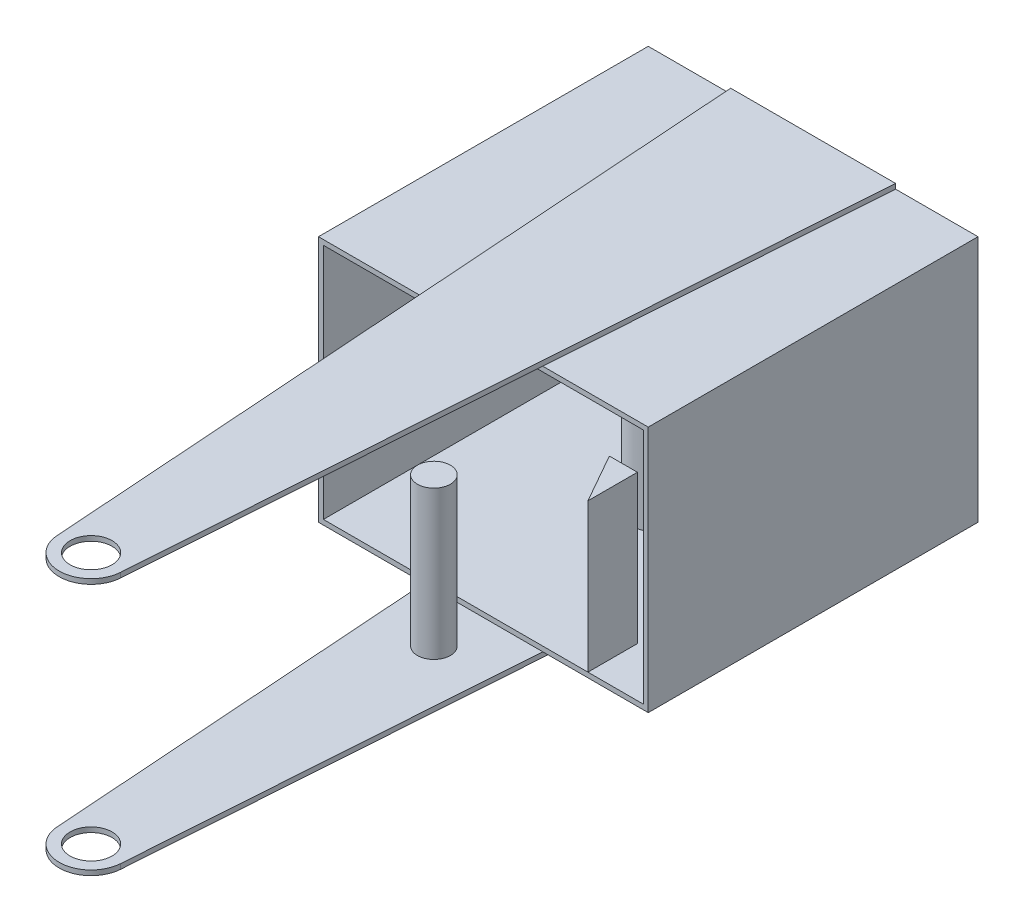
ISO-10303-21;
HEADER;
FILE_DESCRIPTION(('STEP AP214'),'2;1');
FILE_NAME('part.step','',(''),(''),'','','');
FILE_SCHEMA(('AUTOMOTIVE_DESIGN { 1 0 10303 214 1 1 1 1 }'));
ENDSEC;
DATA;
#1=APPLICATION_CONTEXT('core data for automotive mechanical design processes');
#2=APPLICATION_PROTOCOL_DEFINITION('international standard','automotive_design',2000,#1);
#3=PRODUCT_CONTEXT('',#1,'mechanical');
#4=PRODUCT('Part','Part','',(#3));
#5=PRODUCT_RELATED_PRODUCT_CATEGORY('part','',(#4));
#6=PRODUCT_DEFINITION_FORMATION('','',#4);
#7=PRODUCT_DEFINITION_CONTEXT('part definition',#1,'design');
#8=PRODUCT_DEFINITION('design','',#6,#7);
#9=PRODUCT_DEFINITION_SHAPE('','',#8);
#10=(LENGTH_UNIT() NAMED_UNIT(*) SI_UNIT(.MILLI.,.METRE.));
#11=(NAMED_UNIT(*) PLANE_ANGLE_UNIT() SI_UNIT($,.RADIAN.));
#12=(NAMED_UNIT(*) SI_UNIT($,.STERADIAN.) SOLID_ANGLE_UNIT());
#13=UNCERTAINTY_MEASURE_WITH_UNIT(LENGTH_MEASURE(1.E-05),#10,'distance_accuracy_value','');
#14=(GEOMETRIC_REPRESENTATION_CONTEXT(3) GLOBAL_UNCERTAINTY_ASSIGNED_CONTEXT((#13)) GLOBAL_UNIT_ASSIGNED_CONTEXT((#10,
#11,#12)) REPRESENTATION_CONTEXT('',''));
#15=CARTESIAN_POINT('',(0.,0.,0.));
#16=DIRECTION('',(0.,0.,1.));
#17=DIRECTION('',(1.,0.,0.));
#18=AXIS2_PLACEMENT_3D('',#15,#16,#17);
#19=CARTESIAN_POINT('',(0.,3.,200.));
#20=DIRECTION('',(0.,1.,0.));
#21=DIRECTION('',(0.,0.,1.));
#22=AXIS2_PLACEMENT_3D('',#19,#20,#21);
#23=PLANE('',#22);
#24=CARTESIAN_POINT('',(100.,3.,95.));
#25=DIRECTION('',(0.,1.,0.));
#26=DIRECTION('',(0.,0.,1.));
#27=AXIS2_PLACEMENT_3D('',#24,#25,#26);
#28=CIRCLE('',#27,15.);
#29=CARTESIAN_POINT('',(100.,2.99999999999999,80.));
#30=VERTEX_POINT('',#29);
#31=EDGE_CURVE('E229',#30,#30,#28,.T.);
#32=ORIENTED_EDGE('',*,*,#31,.F.);
#33=EDGE_LOOP('',(#32));
#34=FACE_BOUND('',#33,.T.);
#35=DIRECTION('',(1.,0.,0.));
#36=VECTOR('',#35,1.);
#37=CARTESIAN_POINT('',(0.,3.,200.));
#38=LINE('',#37,#36);
#39=CARTESIAN_POINT('',(3.,3.,200.));
#40=VERTEX_POINT('',#39);
#41=CARTESIAN_POINT('',(163.429598438491,3.,200.));
#42=VERTEX_POINT('',#41);
#43=EDGE_CURVE('E368',#40,#42,#38,.T.);
#44=ORIENTED_EDGE('',*,*,#43,.T.);
#45=DIRECTION('',(0.493012571980881,0.,0.870022185848612));
#46=VECTOR('',#45,1.);
#47=CARTESIAN_POINT('',(163.429598438491,3.,200.));
#48=LINE('',#47,#46);
#49=CARTESIAN_POINT('',(146.429598438491,3.,170.));
#50=VERTEX_POINT('',#49);
#51=EDGE_CURVE('E213',#50,#42,#48,.T.);
#52=ORIENTED_EDGE('',*,*,#51,.F.);
#53=DIRECTION('',(-1.,0.,0.));
#54=VECTOR('',#53,1.);
#55=CARTESIAN_POINT('',(146.429598438491,3.,170.));
#56=LINE('',#55,#54);
#57=CARTESIAN_POINT('',(163.429598438491,3.,170.));
#58=VERTEX_POINT('',#57);
#59=EDGE_CURVE('E209',#58,#50,#56,.T.);
#60=ORIENTED_EDGE('',*,*,#59,.F.);
#61=DIRECTION('',(0.,0.,-1.));
#62=VECTOR('',#61,1.);
#63=CARTESIAN_POINT('',(163.429598438491,3.,170.));
#64=LINE('',#63,#62);
#65=EDGE_CURVE('E787',#42,#58,#64,.T.);
#66=ORIENTED_EDGE('',*,*,#65,.F.);
#67=CARTESIAN_POINT('',(197.,3.,200.));
#68=VERTEX_POINT('',#67);
#69=EDGE_CURVE('E367',#42,#68,#38,.T.);
#70=ORIENTED_EDGE('',*,*,#69,.T.);
#71=DIRECTION('',(0.,0.,-1.));
#72=VECTOR('',#71,1.);
#73=CARTESIAN_POINT('',(197.,3.,200.));
#74=LINE('',#73,#72);
#75=CARTESIAN_POINT('',(197.,3.,3.));
#76=VERTEX_POINT('',#75);
#77=EDGE_CURVE('E343',#68,#76,#74,.T.);
#78=ORIENTED_EDGE('',*,*,#77,.T.);
#79=DIRECTION('',(1.,0.,0.));
#80=VECTOR('',#79,1.);
#81=CARTESIAN_POINT('',(0.,3.,3.));
#82=LINE('',#81,#80);
#83=CARTESIAN_POINT('',(3.,3.,3.));
#84=VERTEX_POINT('',#83);
#85=EDGE_CURVE('E337',#84,#76,#82,.T.);
#86=ORIENTED_EDGE('',*,*,#85,.F.);
#87=DIRECTION('',(0.,0.,-1.));
#88=VECTOR('',#87,1.);
#89=CARTESIAN_POINT('',(3.,3.,200.));
#90=LINE('',#89,#88);
#91=EDGE_CURVE('E338',#40,#84,#90,.T.);
#92=ORIENTED_EDGE('',*,*,#91,.F.);
#93=EDGE_LOOP('',(#44,#52,#60,#66,#70,#78,#86,#92));
#94=FACE_BOUND('',#93,.T.);
#95=ADVANCED_FACE('F45',(#34,#94),#23,.T.);
#96=CARTESIAN_POINT('',(0.,0.,200.));
#97=DIRECTION('',(0.,1.,0.));
#98=DIRECTION('',(0.,0.,1.));
#99=AXIS2_PLACEMENT_3D('',#96,#97,#98);
#100=PLANE('',#99);
#101=DIRECTION('',(1.,0.,0.));
#102=VECTOR('',#101,1.);
#103=CARTESIAN_POINT('',(0.,0.,200.));
#104=LINE('',#103,#102);
#105=CARTESIAN_POINT('',(136.014637611297,0.,200.));
#106=VERTEX_POINT('',#105);
#107=CARTESIAN_POINT('',(200.,0.,200.));
#108=VERTEX_POINT('',#107);
#109=EDGE_CURVE('E382',#106,#108,#104,.T.);
#110=ORIENTED_EDGE('',*,*,#109,.F.);
#111=DIRECTION('',(0.0697564737441293,0.,-0.997564050259824));
#112=VECTOR('',#111,1.);
#113=CARTESIAN_POINT('',(119.283762174899,0.,439.262665798529));
#114=LINE('',#113,#112);
#115=CARTESIAN_POINT('',(150.,0.,0.));
#116=VERTEX_POINT('',#115);
#117=EDGE_CURVE('E11',#106,#116,#114,.T.);
#118=ORIENTED_EDGE('',*,*,#117,.T.);
#119=DIRECTION('',(1.,0.,0.));
#120=VECTOR('',#119,1.);
#121=CARTESIAN_POINT('',(0.,0.,0.));
#122=LINE('',#121,#120);
#123=CARTESIAN_POINT('',(200.,0.,0.));
#124=VERTEX_POINT('',#123);
#125=EDGE_CURVE('E402',#116,#124,#122,.T.);
#126=ORIENTED_EDGE('',*,*,#125,.T.);
#127=DIRECTION('',(0.,0.,-1.));
#128=VECTOR('',#127,1.);
#129=CARTESIAN_POINT('',(200.,0.,200.));
#130=LINE('',#129,#128);
#131=EDGE_CURVE('E419',#108,#124,#130,.T.);
#132=ORIENTED_EDGE('',*,*,#131,.F.);
#133=EDGE_LOOP('',(#110,#118,#126,#132));
#134=FACE_BOUND('',#133,.T.);
#135=ADVANCED_FACE('F491',(#134),#100,.F.);
#136=CARTESIAN_POINT('',(0.,150.,200.));
#137=DIRECTION('',(0.,-1.,0.));
#138=DIRECTION('',(0.,0.,-1.));
#139=AXIS2_PLACEMENT_3D('',#136,#137,#138);
#140=PLANE('',#139);
#141=DIRECTION('',(0.0697564737441293,0.,-0.997564050259824));
#142=VECTOR('',#141,1.);
#143=CARTESIAN_POINT('',(119.283762174899,150.,439.262665798529));
#144=LINE('',#143,#142);
#145=CARTESIAN_POINT('',(136.014637611297,150.,200.));
#146=VERTEX_POINT('',#145);
#147=CARTESIAN_POINT('',(150.,150.,0.));
#148=VERTEX_POINT('',#147);
#149=EDGE_CURVE('E55',#146,#148,#144,.T.);
#150=ORIENTED_EDGE('',*,*,#149,.F.);
#151=DIRECTION('',(-1.,0.,0.));
#152=VECTOR('',#151,1.);
#153=CARTESIAN_POINT('',(0.,150.,200.));
#154=LINE('',#153,#152);
#155=CARTESIAN_POINT('',(200.,150.,200.));
#156=VERTEX_POINT('',#155);
#157=EDGE_CURVE('E393',#156,#146,#154,.T.);
#158=ORIENTED_EDGE('',*,*,#157,.F.);
#159=DIRECTION('',(0.,0.,-1.));
#160=VECTOR('',#159,1.);
#161=CARTESIAN_POINT('',(200.,150.,200.));
#162=LINE('',#161,#160);
#163=CARTESIAN_POINT('',(200.,150.,0.));
#164=VERTEX_POINT('',#163);
#165=EDGE_CURVE('E416',#156,#164,#162,.T.);
#166=ORIENTED_EDGE('',*,*,#165,.T.);
#167=DIRECTION('',(-1.,0.,0.));
#168=VECTOR('',#167,1.);
#169=CARTESIAN_POINT('',(0.,150.,0.));
#170=LINE('',#169,#168);
#171=EDGE_CURVE('E383',#164,#148,#170,.T.);
#172=ORIENTED_EDGE('',*,*,#171,.T.);
#173=EDGE_LOOP('',(#150,#158,#166,#172));
#174=FACE_BOUND('',#173,.T.);
#175=ADVANCED_FACE('F495',(#174),#140,.F.);
#176=DIRECTION('',(0.0697564737441293,0.,0.997564050259824));
#177=VECTOR('',#176,1.);
#178=CARTESIAN_POINT('',(80.7162378251005,150.,439.262665798529));
#179=LINE('',#178,#177);
#180=CARTESIAN_POINT('',(50.,150.,0.));
#181=VERTEX_POINT('',#180);
#182=CARTESIAN_POINT('',(63.9853623887029,150.,200.));
#183=VERTEX_POINT('',#182);
#184=EDGE_CURVE('E312',#181,#183,#179,.T.);
#185=ORIENTED_EDGE('',*,*,#184,.F.);
#186=CARTESIAN_POINT('',(0.,150.,0.));
#187=VERTEX_POINT('',#186);
#188=EDGE_CURVE('E410',#181,#187,#170,.T.);
#189=ORIENTED_EDGE('',*,*,#188,.T.);
#190=DIRECTION('',(0.,0.,-1.));
#191=VECTOR('',#190,1.);
#192=CARTESIAN_POINT('',(0.,150.,200.));
#193=LINE('',#192,#191);
#194=CARTESIAN_POINT('',(0.,150.,200.));
#195=VERTEX_POINT('',#194);
#196=EDGE_CURVE('E397',#195,#187,#193,.T.);
#197=ORIENTED_EDGE('',*,*,#196,.F.);
#198=EDGE_CURVE('E392',#183,#195,#154,.T.);
#199=ORIENTED_EDGE('',*,*,#198,.F.);
#200=EDGE_LOOP('',(#185,#189,#197,#199));
#201=FACE_BOUND('',#200,.T.);
#202=ADVANCED_FACE('F466',(#201),#140,.F.);
#203=CARTESIAN_POINT('',(0.,0.,200.));
#204=DIRECTION('',(0.,0.,-1.));
#205=DIRECTION('',(-1.,0.,0.));
#206=AXIS2_PLACEMENT_3D('',#203,#204,#205);
#207=PLANE('',#206);
#208=DIRECTION('',(0.,-1.,0.));
#209=VECTOR('',#208,1.);
#210=CARTESIAN_POINT('',(0.,0.,200.));
#211=LINE('',#210,#209);
#212=CARTESIAN_POINT('',(0.,0.,200.));
#213=VERTEX_POINT('',#212);
#214=EDGE_CURVE('E378',#195,#213,#211,.T.);
#215=ORIENTED_EDGE('',*,*,#214,.T.);
#216=CARTESIAN_POINT('',(63.9853623887029,0.,200.));
#217=VERTEX_POINT('',#216);
#218=EDGE_CURVE('E384',#213,#217,#104,.T.);
#219=ORIENTED_EDGE('',*,*,#218,.T.);
#220=EDGE_CURVE('E389',#217,#106,#104,.T.);
#221=ORIENTED_EDGE('',*,*,#220,.T.);
#222=ORIENTED_EDGE('',*,*,#109,.T.);
#223=DIRECTION('',(0.,1.,0.));
#224=VECTOR('',#223,1.);
#225=CARTESIAN_POINT('',(200.,0.,200.));
#226=LINE('',#225,#224);
#227=EDGE_CURVE('E388',#108,#156,#226,.T.);
#228=ORIENTED_EDGE('',*,*,#227,.T.);
#229=ORIENTED_EDGE('',*,*,#157,.T.);
#230=EDGE_CURVE('E398',#146,#183,#154,.T.);
#231=ORIENTED_EDGE('',*,*,#230,.T.);
#232=ORIENTED_EDGE('',*,*,#198,.T.);
#233=EDGE_LOOP('',(#215,#219,#221,#222,#228,#229,#231,#232));
#234=FACE_BOUND('',#233,.T.);
#235=DIRECTION('',(0.,-1.,0.));
#236=VECTOR('',#235,1.);
#237=CARTESIAN_POINT('',(3.,0.,200.));
#238=LINE('',#237,#236);
#239=CARTESIAN_POINT('',(3.,147.,200.));
#240=VERTEX_POINT('',#239);
#241=EDGE_CURVE('E364',#240,#40,#238,.T.);
#242=ORIENTED_EDGE('',*,*,#241,.F.);
#243=DIRECTION('',(-1.,0.,0.));
#244=VECTOR('',#243,1.);
#245=CARTESIAN_POINT('',(0.,147.,200.));
#246=LINE('',#245,#244);
#247=CARTESIAN_POINT('',(197.,147.,200.));
#248=VERTEX_POINT('',#247);
#249=EDGE_CURVE('E349',#248,#240,#246,.T.);
#250=ORIENTED_EDGE('',*,*,#249,.F.);
#251=DIRECTION('',(0.,1.,0.));
#252=VECTOR('',#251,1.);
#253=CARTESIAN_POINT('',(197.,0.,200.));
#254=LINE('',#253,#252);
#255=EDGE_CURVE('E372',#68,#248,#254,.T.);
#256=ORIENTED_EDGE('',*,*,#255,.F.);
#257=ORIENTED_EDGE('',*,*,#69,.F.);
#258=ORIENTED_EDGE('',*,*,#43,.F.);
#259=EDGE_LOOP('',(#242,#250,#256,#257,#258));
#260=FACE_BOUND('',#259,.T.);
#261=ADVANCED_FACE('F462',(#234,#260),#207,.F.);
#262=CARTESIAN_POINT('',(0.,0.,200.));
#263=DIRECTION('',(1.,0.,0.));
#264=DIRECTION('',(0.,0.,-1.));
#265=AXIS2_PLACEMENT_3D('',#262,#263,#264);
#266=PLANE('',#265);
#267=DIRECTION('',(0.,-1.,0.));
#268=VECTOR('',#267,1.);
#269=CARTESIAN_POINT('',(0.,0.,0.));
#270=LINE('',#269,#268);
#271=CARTESIAN_POINT('',(0.,0.,0.));
#272=VERTEX_POINT('',#271);
#273=EDGE_CURVE('E342',#187,#272,#270,.T.);
#274=ORIENTED_EDGE('',*,*,#273,.T.);
#275=DIRECTION('',(0.,0.,-1.));
#276=VECTOR('',#275,1.);
#277=CARTESIAN_POINT('',(0.,0.,200.));
#278=LINE('',#277,#276);
#279=EDGE_CURVE('E49',#213,#272,#278,.T.);
#280=ORIENTED_EDGE('',*,*,#279,.F.);
#281=ORIENTED_EDGE('',*,*,#214,.F.);
#282=ORIENTED_EDGE('',*,*,#196,.T.);
#283=EDGE_LOOP('',(#274,#280,#281,#282));
#284=FACE_BOUND('',#283,.T.);
#285=ADVANCED_FACE('F47',(#284),#266,.F.);
#286=CARTESIAN_POINT('',(50.,0.,0.));
#287=VERTEX_POINT('',#286);
#288=EDGE_CURVE('E403',#272,#287,#122,.T.);
#289=ORIENTED_EDGE('',*,*,#288,.T.);
#290=DIRECTION('',(0.0697564737441293,0.,0.997564050259824));
#291=VECTOR('',#290,1.);
#292=CARTESIAN_POINT('',(80.7162378251005,0.,439.262665798529));
#293=LINE('',#292,#291);
#294=EDGE_CURVE('E251',#287,#217,#293,.T.);
#295=ORIENTED_EDGE('',*,*,#294,.T.);
#296=ORIENTED_EDGE('',*,*,#218,.F.);
#297=ORIENTED_EDGE('',*,*,#279,.T.);
#298=EDGE_LOOP('',(#289,#295,#296,#297));
#299=FACE_BOUND('',#298,.T.);
#300=ADVANCED_FACE('F468',(#299),#100,.F.);
#301=CARTESIAN_POINT('',(200.,0.,200.));
#302=DIRECTION('',(-1.,0.,0.));
#303=DIRECTION('',(0.,0.,1.));
#304=AXIS2_PLACEMENT_3D('',#301,#302,#303);
#305=PLANE('',#304);
#306=DIRECTION('',(0.,1.,0.));
#307=VECTOR('',#306,1.);
#308=CARTESIAN_POINT('',(200.,0.,0.));
#309=LINE('',#308,#307);
#310=EDGE_CURVE('E407',#124,#164,#309,.T.);
#311=ORIENTED_EDGE('',*,*,#310,.T.);
#312=ORIENTED_EDGE('',*,*,#165,.F.);
#313=ORIENTED_EDGE('',*,*,#227,.F.);
#314=ORIENTED_EDGE('',*,*,#131,.T.);
#315=EDGE_LOOP('',(#311,#312,#313,#314));
#316=FACE_BOUND('',#315,.T.);
#317=ADVANCED_FACE('F494',(#316),#305,.F.);
#318=CARTESIAN_POINT('',(0.,0.,0.));
#319=DIRECTION('',(0.,0.,-1.));
#320=DIRECTION('',(-1.,0.,0.));
#321=AXIS2_PLACEMENT_3D('',#318,#319,#320);
#322=PLANE('',#321);
#323=ORIENTED_EDGE('',*,*,#273,.F.);
#324=ORIENTED_EDGE('',*,*,#188,.F.);
#325=DIRECTION('',(0.,-1.,0.));
#326=VECTOR('',#325,1.);
#327=CARTESIAN_POINT('',(50.,153.,0.));
#328=LINE('',#327,#326);
#329=CARTESIAN_POINT('',(50.,153.,0.));
#330=VERTEX_POINT('',#329);
#331=EDGE_CURVE('E325',#330,#181,#328,.T.);
#332=ORIENTED_EDGE('',*,*,#331,.F.);
#333=DIRECTION('',(-1.,0.,0.));
#334=VECTOR('',#333,1.);
#335=CARTESIAN_POINT('',(150.,153.,0.));
#336=LINE('',#335,#334);
#337=CARTESIAN_POINT('',(150.,153.,0.));
#338=VERTEX_POINT('',#337);
#339=EDGE_CURVE('E297',#338,#330,#336,.T.);
#340=ORIENTED_EDGE('',*,*,#339,.F.);
#341=DIRECTION('',(0.,-1.,0.));
#342=VECTOR('',#341,1.);
#343=CARTESIAN_POINT('',(150.,153.,0.));
#344=LINE('',#343,#342);
#345=EDGE_CURVE('E329',#338,#148,#344,.T.);
#346=ORIENTED_EDGE('',*,*,#345,.T.);
#347=ORIENTED_EDGE('',*,*,#171,.F.);
#348=ORIENTED_EDGE('',*,*,#310,.F.);
#349=ORIENTED_EDGE('',*,*,#125,.F.);
#350=DIRECTION('',(0.,1.,0.));
#351=VECTOR('',#350,1.);
#352=CARTESIAN_POINT('',(150.,-3.,0.));
#353=LINE('',#352,#351);
#354=CARTESIAN_POINT('',(150.,-3.,0.));
#355=VERTEX_POINT('',#354);
#356=EDGE_CURVE('E262',#355,#116,#353,.T.);
#357=ORIENTED_EDGE('',*,*,#356,.F.);
#358=DIRECTION('',(-1.,0.,0.));
#359=VECTOR('',#358,1.);
#360=CARTESIAN_POINT('',(150.,-3.,0.));
#361=LINE('',#360,#359);
#362=CARTESIAN_POINT('',(50.,-3.,0.));
#363=VERTEX_POINT('',#362);
#364=EDGE_CURVE('E259',#355,#363,#361,.T.);
#365=ORIENTED_EDGE('',*,*,#364,.T.);
#366=DIRECTION('',(0.,1.,0.));
#367=VECTOR('',#366,1.);
#368=CARTESIAN_POINT('',(50.,-3.,0.));
#369=LINE('',#368,#367);
#370=EDGE_CURVE('E275',#363,#287,#369,.T.);
#371=ORIENTED_EDGE('',*,*,#370,.T.);
#372=ORIENTED_EDGE('',*,*,#288,.F.);
#373=EDGE_LOOP('',(#323,#324,#332,#340,#346,#347,#348,#349,#357,#365,#371,#372));
#374=FACE_BOUND('',#373,.T.);
#375=ADVANCED_FACE('F442',(#374),#322,.T.);
#376=CARTESIAN_POINT('',(3.,0.,200.));
#377=DIRECTION('',(1.,0.,0.));
#378=DIRECTION('',(0.,0.,-1.));
#379=AXIS2_PLACEMENT_3D('',#376,#377,#378);
#380=PLANE('',#379);
#381=DIRECTION('',(0.,-1.,0.));
#382=VECTOR('',#381,1.);
#383=CARTESIAN_POINT('',(3.,0.,3.));
#384=LINE('',#383,#382);
#385=CARTESIAN_POINT('',(3.,147.,3.));
#386=VERTEX_POINT('',#385);
#387=EDGE_CURVE('E333',#386,#84,#384,.T.);
#388=ORIENTED_EDGE('',*,*,#387,.F.);
#389=DIRECTION('',(0.,0.,-1.));
#390=VECTOR('',#389,1.);
#391=CARTESIAN_POINT('',(3.,147.,200.));
#392=LINE('',#391,#390);
#393=EDGE_CURVE('E344',#240,#386,#392,.T.);
#394=ORIENTED_EDGE('',*,*,#393,.F.);
#395=ORIENTED_EDGE('',*,*,#241,.T.);
#396=ORIENTED_EDGE('',*,*,#91,.T.);
#397=EDGE_LOOP('',(#388,#394,#395,#396));
#398=FACE_BOUND('',#397,.T.);
#399=ADVANCED_FACE('F513',(#398),#380,.T.);
#400=CARTESIAN_POINT('',(197.,0.,200.));
#401=DIRECTION('',(-1.,0.,0.));
#402=DIRECTION('',(0.,0.,1.));
#403=AXIS2_PLACEMENT_3D('',#400,#401,#402);
#404=PLANE('',#403);
#405=DIRECTION('',(0.,1.,0.));
#406=VECTOR('',#405,1.);
#407=CARTESIAN_POINT('',(197.,0.,3.));
#408=LINE('',#407,#406);
#409=CARTESIAN_POINT('',(197.,147.,3.));
#410=VERTEX_POINT('',#409);
#411=EDGE_CURVE('E352',#76,#410,#408,.T.);
#412=ORIENTED_EDGE('',*,*,#411,.F.);
#413=ORIENTED_EDGE('',*,*,#77,.F.);
#414=ORIENTED_EDGE('',*,*,#255,.T.);
#415=DIRECTION('',(0.,0.,-1.));
#416=VECTOR('',#415,1.);
#417=CARTESIAN_POINT('',(197.,147.,200.));
#418=LINE('',#417,#416);
#419=EDGE_CURVE('E348',#248,#410,#418,.T.);
#420=ORIENTED_EDGE('',*,*,#419,.T.);
#421=EDGE_LOOP('',(#412,#413,#414,#420));
#422=FACE_BOUND('',#421,.T.);
#423=ADVANCED_FACE('F515',(#422),#404,.T.);
#424=CARTESIAN_POINT('',(0.,147.,200.));
#425=DIRECTION('',(0.,-1.,0.));
#426=DIRECTION('',(0.,0.,-1.));
#427=AXIS2_PLACEMENT_3D('',#424,#425,#426);
#428=PLANE('',#427);
#429=DIRECTION('',(-1.,0.,0.));
#430=VECTOR('',#429,1.);
#431=CARTESIAN_POINT('',(0.,147.,3.));
#432=LINE('',#431,#430);
#433=EDGE_CURVE('E358',#410,#386,#432,.T.);
#434=ORIENTED_EDGE('',*,*,#433,.F.);
#435=ORIENTED_EDGE('',*,*,#419,.F.);
#436=ORIENTED_EDGE('',*,*,#249,.T.);
#437=ORIENTED_EDGE('',*,*,#393,.T.);
#438=EDGE_LOOP('',(#434,#435,#436,#437));
#439=FACE_BOUND('',#438,.T.);
#440=ADVANCED_FACE('F518',(#439),#428,.T.);
#441=CARTESIAN_POINT('',(0.,0.,3.));
#442=DIRECTION('',(0.,0.,-1.));
#443=DIRECTION('',(-1.,0.,0.));
#444=AXIS2_PLACEMENT_3D('',#441,#442,#443);
#445=PLANE('',#444);
#446=ORIENTED_EDGE('',*,*,#387,.T.);
#447=ORIENTED_EDGE('',*,*,#85,.T.);
#448=ORIENTED_EDGE('',*,*,#411,.T.);
#449=ORIENTED_EDGE('',*,*,#433,.T.);
#450=EDGE_LOOP('',(#446,#447,#448,#449));
#451=FACE_BOUND('',#450,.T.);
#452=ADVANCED_FACE('F522',(#451),#445,.F.);
#453=CARTESIAN_POINT('',(100.,150.,437.914213787361));
#454=DIRECTION('',(0.,-1.,0.));
#455=DIRECTION('',(0.,0.,-1.));
#456=AXIS2_PLACEMENT_3D('',#453,#454,#455);
#457=PLANE('',#456);
#458=CARTESIAN_POINT('',(100.,150.,437.914213787361));
#459=DIRECTION('',(0.,1.,0.));
#460=DIRECTION('',(0.,0.,-1.));
#461=AXIS2_PLACEMENT_3D('',#458,#459,#460);
#462=CIRCLE('',#461,12.7);
#463=CARTESIAN_POINT('',(100.,150.,425.214213787361));
#464=VERTEX_POINT('',#463);
#465=EDGE_CURVE('E284',#464,#464,#462,.T.);
#466=ORIENTED_EDGE('',*,*,#465,.T.);
#467=EDGE_LOOP('',(#466));
#468=FACE_BOUND('',#467,.T.);
#469=ORIENTED_EDGE('',*,*,#230,.F.);
#470=CARTESIAN_POINT('',(119.283762174899,150.,439.262665798529));
#471=VERTEX_POINT('',#470);
#472=EDGE_CURVE('E289',#471,#146,#144,.T.);
#473=ORIENTED_EDGE('',*,*,#472,.F.);
#474=CARTESIAN_POINT('',(100.,150.,437.914213787361));
#475=DIRECTION('',(0.,1.,0.));
#476=DIRECTION('',(0.,0.,-1.));
#477=AXIS2_PLACEMENT_3D('',#474,#475,#476);
#478=CIRCLE('',#477,19.3308511567522);
#479=CARTESIAN_POINT('',(80.7162378251005,150.,439.262665798529));
#480=VERTEX_POINT('',#479);
#481=EDGE_CURVE('E298',#480,#471,#478,.T.);
#482=ORIENTED_EDGE('',*,*,#481,.F.);
#483=EDGE_CURVE('E311',#183,#480,#179,.T.);
#484=ORIENTED_EDGE('',*,*,#483,.F.);
#485=EDGE_LOOP('',(#469,#473,#482,#484));
#486=FACE_BOUND('',#485,.T.);
#487=ADVANCED_FACE('F455',(#468,#486),#457,.T.);
#488=CARTESIAN_POINT('',(100.,153.,437.914213787361));
#489=DIRECTION('',(0.,-1.,0.));
#490=DIRECTION('',(0.,0.,-1.));
#491=AXIS2_PLACEMENT_3D('',#488,#489,#490);
#492=PLANE('',#491);
#493=DIRECTION('',(0.0697564737441293,0.,-0.997564050259824));
#494=VECTOR('',#493,1.);
#495=CARTESIAN_POINT('',(119.283762174899,153.,439.262665798529));
#496=LINE('',#495,#494);
#497=CARTESIAN_POINT('',(119.283762174899,153.,439.262665798529));
#498=VERTEX_POINT('',#497);
#499=EDGE_CURVE('E293',#498,#338,#496,.T.);
#500=ORIENTED_EDGE('',*,*,#499,.T.);
#501=ORIENTED_EDGE('',*,*,#339,.T.);
#502=DIRECTION('',(0.0697564737441293,0.,0.997564050259824));
#503=VECTOR('',#502,1.);
#504=CARTESIAN_POINT('',(80.7162378251005,153.,439.262665798529));
#505=LINE('',#504,#503);
#506=CARTESIAN_POINT('',(80.7162378251005,153.,439.262665798529));
#507=VERTEX_POINT('',#506);
#508=EDGE_CURVE('E301',#330,#507,#505,.T.);
#509=ORIENTED_EDGE('',*,*,#508,.T.);
#510=CARTESIAN_POINT('',(100.,153.,437.914213787361));
#511=DIRECTION('',(0.,1.,0.));
#512=DIRECTION('',(0.,0.,-1.));
#513=AXIS2_PLACEMENT_3D('',#510,#511,#512);
#514=CIRCLE('',#513,19.3308511567522);
#515=EDGE_CURVE('E304',#507,#498,#514,.T.);
#516=ORIENTED_EDGE('',*,*,#515,.T.);
#517=EDGE_LOOP('',(#500,#501,#509,#516));
#518=FACE_BOUND('',#517,.T.);
#519=CARTESIAN_POINT('',(100.,153.,437.914213787361));
#520=DIRECTION('',(0.,1.,0.));
#521=DIRECTION('',(0.,0.,-1.));
#522=AXIS2_PLACEMENT_3D('',#519,#520,#521);
#523=CIRCLE('',#522,12.7);
#524=CARTESIAN_POINT('',(100.,153.,425.214213787361));
#525=VERTEX_POINT('',#524);
#526=EDGE_CURVE('E285',#525,#525,#523,.T.);
#527=ORIENTED_EDGE('',*,*,#526,.F.);
#528=EDGE_LOOP('',(#527));
#529=FACE_BOUND('',#528,.T.);
#530=ADVANCED_FACE('F447',(#518,#529),#492,.F.);
#531=CARTESIAN_POINT('',(119.283762174899,153.,439.262665798529));
#532=DIRECTION('',(-0.997564050259824,0.,-0.0697564737441293));
#533=DIRECTION('',(-0.0697564737441293,0.,0.997564050259824));
#534=AXIS2_PLACEMENT_3D('',#531,#532,#533);
#535=PLANE('',#534);
#536=ORIENTED_EDGE('',*,*,#472,.T.);
#537=ORIENTED_EDGE('',*,*,#149,.T.);
#538=ORIENTED_EDGE('',*,*,#345,.F.);
#539=ORIENTED_EDGE('',*,*,#499,.F.);
#540=DIRECTION('',(0.,-1.,0.));
#541=VECTOR('',#540,1.);
#542=CARTESIAN_POINT('',(119.283762174899,153.,439.262665798529));
#543=LINE('',#542,#541);
#544=EDGE_CURVE('E307',#498,#471,#543,.T.);
#545=ORIENTED_EDGE('',*,*,#544,.T.);
#546=EDGE_LOOP('',(#536,#537,#538,#539,#545));
#547=FACE_BOUND('',#546,.T.);
#548=ADVANCED_FACE('F434',(#547),#535,.F.);
#549=CARTESIAN_POINT('',(80.7162378251005,153.,439.262665798529));
#550=DIRECTION('',(0.997564050259824,0.,-0.0697564737441293));
#551=DIRECTION('',(-0.0697564737441293,0.,-0.997564050259824));
#552=AXIS2_PLACEMENT_3D('',#549,#550,#551);
#553=PLANE('',#552);
#554=ORIENTED_EDGE('',*,*,#184,.T.);
#555=ORIENTED_EDGE('',*,*,#483,.T.);
#556=DIRECTION('',(0.,-1.,0.));
#557=VECTOR('',#556,1.);
#558=CARTESIAN_POINT('',(80.7162378251005,153.,439.262665798529));
#559=LINE('',#558,#557);
#560=EDGE_CURVE('E321',#507,#480,#559,.T.);
#561=ORIENTED_EDGE('',*,*,#560,.F.);
#562=ORIENTED_EDGE('',*,*,#508,.F.);
#563=ORIENTED_EDGE('',*,*,#331,.T.);
#564=EDGE_LOOP('',(#554,#555,#561,#562,#563));
#565=FACE_BOUND('',#564,.T.);
#566=ADVANCED_FACE('F584',(#565),#553,.F.);
#567=CARTESIAN_POINT('',(100.,153.,437.914213787361));
#568=DIRECTION('',(0.,-1.,0.));
#569=DIRECTION('',(0.,0.,-1.));
#570=AXIS2_PLACEMENT_3D('',#567,#568,#569);
#571=CYLINDRICAL_SURFACE('',#570,19.3308511567522);
#572=ORIENTED_EDGE('',*,*,#481,.T.);
#573=ORIENTED_EDGE('',*,*,#544,.F.);
#574=ORIENTED_EDGE('',*,*,#515,.F.);
#575=ORIENTED_EDGE('',*,*,#560,.T.);
#576=EDGE_LOOP('',(#572,#573,#574,#575));
#577=FACE_BOUND('',#576,.T.);
#578=ADVANCED_FACE('F593',(#577),#571,.T.);
#579=CARTESIAN_POINT('',(100.,153.,437.914213787361));
#580=DIRECTION('',(0.,-1.,0.));
#581=DIRECTION('',(0.,0.,-1.));
#582=AXIS2_PLACEMENT_3D('',#579,#580,#581);
#583=CYLINDRICAL_SURFACE('',#582,12.7);
#584=ORIENTED_EDGE('',*,*,#526,.T.);
#585=EDGE_LOOP('',(#584));
#586=FACE_BOUND('',#585,.T.);
#587=ORIENTED_EDGE('',*,*,#465,.F.);
#588=EDGE_LOOP('',(#587));
#589=FACE_BOUND('',#588,.T.);
#590=ADVANCED_FACE('F604',(#586,#589),#583,.F.);
#591=CARTESIAN_POINT('',(100.,0.,437.914213787361));
#592=DIRECTION('',(0.,1.,0.));
#593=DIRECTION('',(0.,0.,-1.));
#594=AXIS2_PLACEMENT_3D('',#591,#592,#593);
#595=PLANE('',#594);
#596=CARTESIAN_POINT('',(100.,0.,230.));
#597=DIRECTION('',(0.,1.,0.));
#598=DIRECTION('',(0.,0.,1.));
#599=AXIS2_PLACEMENT_3D('',#596,#597,#598);
#600=CIRCLE('',#599,10.);
#601=CARTESIAN_POINT('',(100.,0.,220.));
#602=VERTEX_POINT('',#601);
#603=EDGE_CURVE('E216',#602,#602,#600,.T.);
#604=ORIENTED_EDGE('',*,*,#603,.F.);
#605=EDGE_LOOP('',(#604));
#606=FACE_BOUND('',#605,.T.);
#607=CARTESIAN_POINT('',(100.,0.,437.914213787361));
#608=DIRECTION('',(0.,1.,0.));
#609=DIRECTION('',(0.,0.,-1.));
#610=AXIS2_PLACEMENT_3D('',#607,#608,#609);
#611=CIRCLE('',#610,12.7);
#612=CARTESIAN_POINT('',(100.,0.,425.214213787361));
#613=VERTEX_POINT('',#612);
#614=EDGE_CURVE('E235',#613,#613,#611,.T.);
#615=ORIENTED_EDGE('',*,*,#614,.F.);
#616=EDGE_LOOP('',(#615));
#617=FACE_BOUND('',#616,.T.);
#618=ORIENTED_EDGE('',*,*,#220,.F.);
#619=CARTESIAN_POINT('',(80.7162378251005,0.,439.262665798529));
#620=VERTEX_POINT('',#619);
#621=EDGE_CURVE('E72',#217,#620,#293,.T.);
#622=ORIENTED_EDGE('',*,*,#621,.T.);
#623=CARTESIAN_POINT('',(100.,0.,437.914213787361));
#624=DIRECTION('',(0.,1.,0.));
#625=DIRECTION('',(0.,0.,-1.));
#626=AXIS2_PLACEMENT_3D('',#623,#624,#625);
#627=CIRCLE('',#626,19.3308511567522);
#628=CARTESIAN_POINT('',(119.283762174899,0.,439.262665798529));
#629=VERTEX_POINT('',#628);
#630=EDGE_CURVE('E266',#620,#629,#627,.T.);
#631=ORIENTED_EDGE('',*,*,#630,.T.);
#632=EDGE_CURVE('E57',#629,#106,#114,.T.);
#633=ORIENTED_EDGE('',*,*,#632,.T.);
#634=EDGE_LOOP('',(#618,#622,#631,#633));
#635=FACE_BOUND('',#634,.T.);
#636=ADVANCED_FACE('F479',(#606,#617,#635),#595,.T.);
#637=CARTESIAN_POINT('',(119.283762174899,-3.,439.262665798529));
#638=DIRECTION('',(0.997564050259824,0.,0.0697564737441293));
#639=DIRECTION('',(0.0697564737441293,0.,-0.997564050259824));
#640=AXIS2_PLACEMENT_3D('',#637,#638,#639);
#641=PLANE('',#640);
#642=ORIENTED_EDGE('',*,*,#632,.F.);
#643=DIRECTION('',(0.,1.,0.));
#644=VECTOR('',#643,1.);
#645=CARTESIAN_POINT('',(119.283762174899,-3.,439.262665798529));
#646=LINE('',#645,#644);
#647=CARTESIAN_POINT('',(119.283762174899,-3.,439.262665798529));
#648=VERTEX_POINT('',#647);
#649=EDGE_CURVE('E281',#648,#629,#646,.T.);
#650=ORIENTED_EDGE('',*,*,#649,.F.);
#651=DIRECTION('',(0.0697564737441293,0.,-0.997564050259824));
#652=VECTOR('',#651,1.);
#653=CARTESIAN_POINT('',(119.283762174899,-3.,439.262665798529));
#654=LINE('',#653,#652);
#655=EDGE_CURVE('E246',#648,#355,#654,.T.);
#656=ORIENTED_EDGE('',*,*,#655,.T.);
#657=ORIENTED_EDGE('',*,*,#356,.T.);
#658=ORIENTED_EDGE('',*,*,#117,.F.);
#659=EDGE_LOOP('',(#642,#650,#656,#657,#658));
#660=FACE_BOUND('',#659,.T.);
#661=ADVANCED_FACE('F489',(#660),#641,.T.);
#662=CARTESIAN_POINT('',(100.,-3.,437.914213787361));
#663=DIRECTION('',(0.,1.,0.));
#664=DIRECTION('',(0.,0.,1.));
#665=AXIS2_PLACEMENT_3D('',#662,#663,#664);
#666=CYLINDRICAL_SURFACE('',#665,19.3308511567522);
#667=ORIENTED_EDGE('',*,*,#630,.F.);
#668=DIRECTION('',(0.,1.,0.));
#669=VECTOR('',#668,1.);
#670=CARTESIAN_POINT('',(80.7162378251005,-3.,439.262665798529));
#671=LINE('',#670,#669);
#672=CARTESIAN_POINT('',(80.7162378251005,-3.,439.262665798529));
#673=VERTEX_POINT('',#672);
#674=EDGE_CURVE('E278',#673,#620,#671,.T.);
#675=ORIENTED_EDGE('',*,*,#674,.F.);
#676=CARTESIAN_POINT('',(100.,-3.,437.914213787361));
#677=DIRECTION('',(0.,1.,0.));
#678=DIRECTION('',(0.,0.,-1.));
#679=AXIS2_PLACEMENT_3D('',#676,#677,#678);
#680=CIRCLE('',#679,19.3308511567522);
#681=EDGE_CURVE('E250',#673,#648,#680,.T.);
#682=ORIENTED_EDGE('',*,*,#681,.T.);
#683=ORIENTED_EDGE('',*,*,#649,.T.);
#684=EDGE_LOOP('',(#667,#675,#682,#683));
#685=FACE_BOUND('',#684,.T.);
#686=ADVANCED_FACE('F485',(#685),#666,.T.);
#687=CARTESIAN_POINT('',(80.7162378251005,-3.,439.262665798529));
#688=DIRECTION('',(-0.997564050259824,0.,0.0697564737441293));
#689=DIRECTION('',(0.0697564737441293,0.,0.997564050259824));
#690=AXIS2_PLACEMENT_3D('',#687,#688,#689);
#691=PLANE('',#690);
#692=ORIENTED_EDGE('',*,*,#294,.F.);
#693=ORIENTED_EDGE('',*,*,#370,.F.);
#694=DIRECTION('',(0.0697564737441293,0.,0.997564050259824));
#695=VECTOR('',#694,1.);
#696=CARTESIAN_POINT('',(80.7162378251005,-3.,439.262665798529));
#697=LINE('',#696,#695);
#698=EDGE_CURVE('E255',#363,#673,#697,.T.);
#699=ORIENTED_EDGE('',*,*,#698,.T.);
#700=ORIENTED_EDGE('',*,*,#674,.T.);
#701=ORIENTED_EDGE('',*,*,#621,.F.);
#702=EDGE_LOOP('',(#692,#693,#699,#700,#701));
#703=FACE_BOUND('',#702,.T.);
#704=ADVANCED_FACE('F481',(#703),#691,.T.);
#705=CARTESIAN_POINT('',(100.,-3.,437.914213787361));
#706=DIRECTION('',(0.,1.,0.));
#707=DIRECTION('',(0.,0.,-1.));
#708=AXIS2_PLACEMENT_3D('',#705,#706,#707);
#709=PLANE('',#708);
#710=CARTESIAN_POINT('',(100.,-3.,437.914213787361));
#711=DIRECTION('',(0.,1.,0.));
#712=DIRECTION('',(0.,0.,-1.));
#713=AXIS2_PLACEMENT_3D('',#710,#711,#712);
#714=CIRCLE('',#713,12.7);
#715=CARTESIAN_POINT('',(100.,-3.,425.214213787361));
#716=VERTEX_POINT('',#715);
#717=EDGE_CURVE('E239',#716,#716,#714,.T.);
#718=ORIENTED_EDGE('',*,*,#717,.T.);
#719=EDGE_LOOP('',(#718));
#720=FACE_BOUND('',#719,.T.);
#721=ORIENTED_EDGE('',*,*,#655,.F.);
#722=ORIENTED_EDGE('',*,*,#681,.F.);
#723=ORIENTED_EDGE('',*,*,#698,.F.);
#724=ORIENTED_EDGE('',*,*,#364,.F.);
#725=EDGE_LOOP('',(#721,#722,#723,#724));
#726=FACE_BOUND('',#725,.T.);
#727=ADVANCED_FACE('F661',(#720,#726),#709,.F.);
#728=CARTESIAN_POINT('',(100.,-3.,437.914213787361));
#729=DIRECTION('',(0.,1.,0.));
#730=DIRECTION('',(0.,0.,1.));
#731=AXIS2_PLACEMENT_3D('',#728,#729,#730);
#732=CYLINDRICAL_SURFACE('',#731,12.7);
#733=ORIENTED_EDGE('',*,*,#717,.F.);
#734=EDGE_LOOP('',(#733));
#735=FACE_BOUND('',#734,.T.);
#736=ORIENTED_EDGE('',*,*,#614,.T.);
#737=EDGE_LOOP('',(#736));
#738=FACE_BOUND('',#737,.T.);
#739=ADVANCED_FACE('F671',(#735,#738),#732,.F.);
#740=CARTESIAN_POINT('',(100.,93.,95.));
#741=DIRECTION('',(0.,-1.,0.));
#742=DIRECTION('',(0.,0.,-1.));
#743=AXIS2_PLACEMENT_3D('',#740,#741,#742);
#744=CYLINDRICAL_SURFACE('',#743,15.);
#745=CARTESIAN_POINT('',(100.,93.,95.));
#746=DIRECTION('',(0.,1.,0.));
#747=DIRECTION('',(0.,0.,1.));
#748=AXIS2_PLACEMENT_3D('',#745,#746,#747);
#749=CIRCLE('',#748,15.);
#750=CARTESIAN_POINT('',(100.,93.,80.));
#751=VERTEX_POINT('',#750);
#752=EDGE_CURVE('E231',#751,#751,#749,.T.);
#753=CARTESIAN_POINT('',(100.,93.,80.));
#754=CARTESIAN_POINT('',(100.,92.0625,80.));
#755=CARTESIAN_POINT('',(100.,91.125,80.));
#756=CARTESIAN_POINT('',(100.,89.25,80.));
#757=CARTESIAN_POINT('',(100.,88.3125,80.));
#758=CARTESIAN_POINT('',(100.,86.4375,80.));
#759=CARTESIAN_POINT('',(100.,85.5,80.));
#760=CARTESIAN_POINT('',(100.,83.625,80.));
#761=CARTESIAN_POINT('',(100.,82.6875,80.));
#762=CARTESIAN_POINT('',(100.,80.8125,80.));
#763=CARTESIAN_POINT('',(100.,79.875,80.));
#764=CARTESIAN_POINT('',(100.,78.,80.));
#765=CARTESIAN_POINT('',(100.,77.0625,80.));
#766=CARTESIAN_POINT('',(100.,75.1875,80.));
#767=CARTESIAN_POINT('',(100.,74.25,80.));
#768=CARTESIAN_POINT('',(100.,72.375,80.));
#769=CARTESIAN_POINT('',(100.,71.4375,80.));
#770=CARTESIAN_POINT('',(100.,69.5625,80.));
#771=CARTESIAN_POINT('',(100.,68.625,80.));
#772=CARTESIAN_POINT('',(100.,66.75,80.));
#773=CARTESIAN_POINT('',(100.,65.8125,80.));
#774=CARTESIAN_POINT('',(100.,63.9375,80.));
#775=CARTESIAN_POINT('',(100.,63.,80.));
#776=CARTESIAN_POINT('',(100.,61.125,80.));
#777=CARTESIAN_POINT('',(100.,60.1875,80.));
#778=CARTESIAN_POINT('',(100.,58.3125,80.));
#779=CARTESIAN_POINT('',(100.,57.375,80.));
#780=CARTESIAN_POINT('',(100.,55.5,80.));
#781=CARTESIAN_POINT('',(100.,54.5625,80.));
#782=CARTESIAN_POINT('',(100.,52.6875,80.));
#783=CARTESIAN_POINT('',(100.,51.75,80.));
#784=CARTESIAN_POINT('',(100.,49.875,80.));
#785=CARTESIAN_POINT('',(100.,48.9375,80.));
#786=CARTESIAN_POINT('',(100.,47.0625,80.));
#787=CARTESIAN_POINT('',(100.,46.125,80.));
#788=CARTESIAN_POINT('',(100.,44.25,80.));
#789=CARTESIAN_POINT('',(100.,43.3125,80.));
#790=CARTESIAN_POINT('',(100.,41.4375,80.));
#791=CARTESIAN_POINT('',(100.,40.5,80.));
#792=CARTESIAN_POINT('',(100.,38.625,80.));
#793=CARTESIAN_POINT('',(100.,37.6875,80.));
#794=CARTESIAN_POINT('',(100.,35.8125,80.));
#795=CARTESIAN_POINT('',(100.,34.875,80.));
#796=CARTESIAN_POINT('',(100.,33.,80.));
#797=CARTESIAN_POINT('',(100.,32.0625,80.));
#798=CARTESIAN_POINT('',(100.,30.1875,80.));
#799=CARTESIAN_POINT('',(100.,29.25,80.));
#800=CARTESIAN_POINT('',(100.,27.375,80.));
#801=CARTESIAN_POINT('',(100.,26.4375,80.));
#802=CARTESIAN_POINT('',(100.,24.5625,80.));
#803=CARTESIAN_POINT('',(100.,23.625,80.));
#804=CARTESIAN_POINT('',(100.,21.75,80.));
#805=CARTESIAN_POINT('',(100.,20.8125,80.));
#806=CARTESIAN_POINT('',(100.,18.9375,80.));
#807=CARTESIAN_POINT('',(100.,18.,80.));
#808=CARTESIAN_POINT('',(100.,16.125,80.));
#809=CARTESIAN_POINT('',(100.,15.1875,80.));
#810=CARTESIAN_POINT('',(100.,13.3125,80.));
#811=CARTESIAN_POINT('',(100.,12.375,80.));
#812=CARTESIAN_POINT('',(100.,10.5,80.));
#813=CARTESIAN_POINT('',(100.,9.56249999999999,80.));
#814=CARTESIAN_POINT('',(100.,7.68749999999999,80.));
#815=CARTESIAN_POINT('',(100.,6.74999999999999,80.));
#816=CARTESIAN_POINT('',(100.,4.87499999999999,80.));
#817=CARTESIAN_POINT('',(100.,3.93749999999999,80.));
#818=CARTESIAN_POINT('',(100.,2.99999999999999,80.));
#819=B_SPLINE_CURVE_WITH_KNOTS('',3,(#753,#754,#755,#756,#757,#758,#759,#760,#761,#762,#763,
#764,#765,#766,#767,#768,#769,#770,#771,#772,#773,#774,#775,#776,#777,#778,#779,#780,#781,#782,
#783,#784,#785,#786,#787,#788,#789,#790,#791,#792,#793,#794,#795,#796,#797,#798,#799,#800,#801,
#802,#803,#804,#805,#806,#807,#808,#809,#810,#811,#812,#813,#814,#815,#816,#817,#818),
.UNSPECIFIED.,.F.,.F.,(4,2,2,2,2,2,2,2,2,2,2,2,2,2,2,2,2,2,2,2,2,2,2,2,2,2,2,2,2,2,2,2,4),(0.,
2.8125,5.62499999999999,8.43749999999999,11.25,14.0625,16.875,19.6875,22.5,25.3125,28.125,
30.9375,33.75,36.5625,39.375,42.1875,45.,47.8125,50.625,53.4375,56.25,59.0625,61.875,64.6875,
67.5,70.3125,73.125,75.9375,78.75,81.5625,84.375,87.1875,90.),.UNSPECIFIED.);
#820=EDGE_CURVE('BSEAM682',#751,#30,#819,.T.);
#821=ORIENTED_EDGE('',*,*,#752,.F.);
#822=ORIENTED_EDGE('',*,*,#31,.T.);
#823=ORIENTED_EDGE('',*,*,#820,.T.);
#824=ORIENTED_EDGE('',*,*,#820,.F.);
#825=EDGE_LOOP('',(#821,#823,#822,#824));
#826=FACE_BOUND('',#825,.T.);
#827=ADVANCED_FACE('F682',(#826),#744,.T.);
#828=CARTESIAN_POINT('',(100.,93.,95.));
#829=DIRECTION('',(0.,1.,0.));
#830=DIRECTION('',(0.,0.,1.));
#831=AXIS2_PLACEMENT_3D('',#828,#829,#830);
#832=PLANE('',#831);
#833=ORIENTED_EDGE('',*,*,#752,.T.);
#834=EDGE_LOOP('',(#833));
#835=FACE_BOUND('',#834,.T.);
#836=ADVANCED_FACE('F693',(#835),#832,.T.);
#837=CARTESIAN_POINT('',(100.,90.,230.));
#838=DIRECTION('',(0.,-1.,0.));
#839=DIRECTION('',(0.,0.,-1.));
#840=AXIS2_PLACEMENT_3D('',#837,#838,#839);
#841=CYLINDRICAL_SURFACE('',#840,10.);
#842=CARTESIAN_POINT('',(100.,90.,230.));
#843=DIRECTION('',(0.,1.,0.));
#844=DIRECTION('',(0.,0.,1.));
#845=AXIS2_PLACEMENT_3D('',#842,#843,#844);
#846=CIRCLE('',#845,10.);
#847=CARTESIAN_POINT('',(100.,90.,220.));
#848=VERTEX_POINT('',#847);
#849=EDGE_CURVE('E221',#848,#848,#846,.T.);
#850=CARTESIAN_POINT('',(100.,90.,220.));
#851=CARTESIAN_POINT('',(100.,89.0625,220.));
#852=CARTESIAN_POINT('',(100.,88.125,220.));
#853=CARTESIAN_POINT('',(100.,86.25,220.));
#854=CARTESIAN_POINT('',(100.,85.3125,220.));
#855=CARTESIAN_POINT('',(100.,83.4375,220.));
#856=CARTESIAN_POINT('',(100.,82.5,220.));
#857=CARTESIAN_POINT('',(100.,80.625,220.));
#858=CARTESIAN_POINT('',(100.,79.6875,220.));
#859=CARTESIAN_POINT('',(100.,77.8125,220.));
#860=CARTESIAN_POINT('',(100.,76.875,220.));
#861=CARTESIAN_POINT('',(100.,75.,220.));
#862=CARTESIAN_POINT('',(100.,74.0625,220.));
#863=CARTESIAN_POINT('',(100.,72.1875,220.));
#864=CARTESIAN_POINT('',(100.,71.25,220.));
#865=CARTESIAN_POINT('',(100.,69.375,220.));
#866=CARTESIAN_POINT('',(100.,68.4375,220.));
#867=CARTESIAN_POINT('',(100.,66.5625,220.));
#868=CARTESIAN_POINT('',(100.,65.625,220.));
#869=CARTESIAN_POINT('',(100.,63.75,220.));
#870=CARTESIAN_POINT('',(100.,62.8125,220.));
#871=CARTESIAN_POINT('',(100.,60.9375,220.));
#872=CARTESIAN_POINT('',(100.,60.,220.));
#873=CARTESIAN_POINT('',(100.,58.125,220.));
#874=CARTESIAN_POINT('',(100.,57.1875,220.));
#875=CARTESIAN_POINT('',(100.,55.3125,220.));
#876=CARTESIAN_POINT('',(100.,54.375,220.));
#877=CARTESIAN_POINT('',(100.,52.5,220.));
#878=CARTESIAN_POINT('',(100.,51.5625,220.));
#879=CARTESIAN_POINT('',(100.,49.6875,220.));
#880=CARTESIAN_POINT('',(100.,48.75,220.));
#881=CARTESIAN_POINT('',(100.,46.875,220.));
#882=CARTESIAN_POINT('',(100.,45.9375,220.));
#883=CARTESIAN_POINT('',(100.,44.0625,220.));
#884=CARTESIAN_POINT('',(100.,43.125,220.));
#885=CARTESIAN_POINT('',(100.,41.25,220.));
#886=CARTESIAN_POINT('',(100.,40.3125,220.));
#887=CARTESIAN_POINT('',(100.,38.4375,220.));
#888=CARTESIAN_POINT('',(100.,37.5,220.));
#889=CARTESIAN_POINT('',(100.,35.625,220.));
#890=CARTESIAN_POINT('',(100.,34.6875,220.));
#891=CARTESIAN_POINT('',(100.,32.8125,220.));
#892=CARTESIAN_POINT('',(100.,31.875,220.));
#893=CARTESIAN_POINT('',(100.,30.,220.));
#894=CARTESIAN_POINT('',(100.,29.0625,220.));
#895=CARTESIAN_POINT('',(100.,27.1875,220.));
#896=CARTESIAN_POINT('',(100.,26.25,220.));
#897=CARTESIAN_POINT('',(100.,24.375,220.));
#898=CARTESIAN_POINT('',(100.,23.4375,220.));
#899=CARTESIAN_POINT('',(100.,21.5625,220.));
#900=CARTESIAN_POINT('',(100.,20.625,220.));
#901=CARTESIAN_POINT('',(100.,18.75,220.));
#902=CARTESIAN_POINT('',(100.,17.8125,220.));
#903=CARTESIAN_POINT('',(100.,15.9375,220.));
#904=CARTESIAN_POINT('',(100.,15.,220.));
#905=CARTESIAN_POINT('',(100.,13.125,220.));
#906=CARTESIAN_POINT('',(100.,12.1875,220.));
#907=CARTESIAN_POINT('',(100.,10.3125,220.));
#908=CARTESIAN_POINT('',(100.,9.37499999999999,220.));
#909=CARTESIAN_POINT('',(100.,7.49999999999999,220.));
#910=CARTESIAN_POINT('',(100.,6.56249999999999,220.));
#911=CARTESIAN_POINT('',(100.,4.68749999999999,220.));
#912=CARTESIAN_POINT('',(100.,3.74999999999998,220.));
#913=CARTESIAN_POINT('',(100.,1.87499999999998,220.));
#914=CARTESIAN_POINT('',(100.,0.937499999999986,220.));
#915=CARTESIAN_POINT('',(100.,0.,220.));
#916=B_SPLINE_CURVE_WITH_KNOTS('',3,(#850,#851,#852,#853,#854,#855,#856,#857,#858,#859,#860,
#861,#862,#863,#864,#865,#866,#867,#868,#869,#870,#871,#872,#873,#874,#875,#876,#877,#878,#879,
#880,#881,#882,#883,#884,#885,#886,#887,#888,#889,#890,#891,#892,#893,#894,#895,#896,#897,#898,
#899,#900,#901,#902,#903,#904,#905,#906,#907,#908,#909,#910,#911,#912,#913,#914,#915),
.UNSPECIFIED.,.F.,.F.,(4,2,2,2,2,2,2,2,2,2,2,2,2,2,2,2,2,2,2,2,2,2,2,2,2,2,2,2,2,2,2,2,4),(0.,
2.81250000000001,5.62500000000001,8.43750000000001,11.25,14.0625,16.875,19.6875,22.5,25.3125,
28.125,30.9375,33.75,36.5625,39.375,42.1875,45.,47.8125,50.625,53.4375,56.25,59.0625,61.875,
64.6875,67.5,70.3125,73.125,75.9375,78.75,81.5625,84.375,87.1875,90.),.UNSPECIFIED.);
#917=EDGE_CURVE('BSEAM704',#848,#602,#916,.T.);
#918=ORIENTED_EDGE('',*,*,#849,.F.);
#919=ORIENTED_EDGE('',*,*,#603,.T.);
#920=ORIENTED_EDGE('',*,*,#917,.T.);
#921=ORIENTED_EDGE('',*,*,#917,.F.);
#922=EDGE_LOOP('',(#918,#920,#919,#921));
#923=FACE_BOUND('',#922,.T.);
#924=ADVANCED_FACE('F704',(#923),#841,.T.);
#925=CARTESIAN_POINT('',(100.,90.,230.));
#926=DIRECTION('',(0.,1.,0.));
#927=DIRECTION('',(0.,0.,1.));
#928=AXIS2_PLACEMENT_3D('',#925,#926,#927);
#929=PLANE('',#928);
#930=ORIENTED_EDGE('',*,*,#849,.T.);
#931=EDGE_LOOP('',(#930));
#932=FACE_BOUND('',#931,.T.);
#933=ADVANCED_FACE('F722',(#932),#929,.T.);
#934=CARTESIAN_POINT('',(163.429598438491,93.,200.));
#935=DIRECTION('',(0.870022185848612,0.,-0.493012571980881));
#936=DIRECTION('',(-0.493012571980881,0.,-0.870022185848612));
#937=AXIS2_PLACEMENT_3D('',#934,#935,#936);
#938=PLANE('',#937);
#939=ORIENTED_EDGE('',*,*,#51,.T.);
#940=DIRECTION('',(0.,-1.,0.));
#941=VECTOR('',#940,1.);
#942=CARTESIAN_POINT('',(163.429598438491,93.,200.));
#943=LINE('',#942,#941);
#944=CARTESIAN_POINT('',(163.429598438491,93.,200.));
#945=VERTEX_POINT('',#944);
#946=EDGE_CURVE('E196',#945,#42,#943,.T.);
#947=ORIENTED_EDGE('',*,*,#946,.F.);
#948=DIRECTION('',(0.493012571980881,0.,0.870022185848612));
#949=VECTOR('',#948,1.);
#950=CARTESIAN_POINT('',(163.429598438491,93.,200.));
#951=LINE('',#950,#949);
#952=CARTESIAN_POINT('',(146.429598438491,93.,170.));
#953=VERTEX_POINT('',#952);
#954=EDGE_CURVE('E201',#953,#945,#951,.T.);
#955=ORIENTED_EDGE('',*,*,#954,.F.);
#956=DIRECTION('',(0.,-1.,0.));
#957=VECTOR('',#956,1.);
#958=CARTESIAN_POINT('',(146.429598438491,93.,170.));
#959=LINE('',#958,#957);
#960=EDGE_CURVE('E223',#953,#50,#959,.T.);
#961=ORIENTED_EDGE('',*,*,#960,.T.);
#962=EDGE_LOOP('',(#939,#947,#955,#961));
#963=FACE_BOUND('',#962,.T.);
#964=ADVANCED_FACE('F211',(#963),#938,.F.);
#965=CARTESIAN_POINT('',(163.429598438491,93.,170.));
#966=DIRECTION('',(-1.,0.,0.));
#967=DIRECTION('',(0.,0.,1.));
#968=AXIS2_PLACEMENT_3D('',#965,#966,#967);
#969=PLANE('',#968);
#970=ORIENTED_EDGE('',*,*,#65,.T.);
#971=DIRECTION('',(0.,-1.,0.));
#972=VECTOR('',#971,1.);
#973=CARTESIAN_POINT('',(163.429598438491,93.,170.));
#974=LINE('',#973,#972);
#975=CARTESIAN_POINT('',(163.429598438491,93.,170.));
#976=VERTEX_POINT('',#975);
#977=EDGE_CURVE('E64',#976,#58,#974,.T.);
#978=ORIENTED_EDGE('',*,*,#977,.F.);
#979=DIRECTION('',(0.,0.,-1.));
#980=VECTOR('',#979,1.);
#981=CARTESIAN_POINT('',(163.429598438491,93.,170.));
#982=LINE('',#981,#980);
#983=EDGE_CURVE('E192',#945,#976,#982,.T.);
#984=ORIENTED_EDGE('',*,*,#983,.F.);
#985=ORIENTED_EDGE('',*,*,#946,.T.);
#986=EDGE_LOOP('',(#970,#978,#984,#985));
#987=FACE_BOUND('',#986,.T.);
#988=ADVANCED_FACE('F194',(#987),#969,.F.);
#989=CARTESIAN_POINT('',(146.429598438491,93.,170.));
#990=DIRECTION('',(0.,0.,1.));
#991=DIRECTION('',(1.,0.,0.));
#992=AXIS2_PLACEMENT_3D('',#989,#990,#991);
#993=PLANE('',#992);
#994=ORIENTED_EDGE('',*,*,#59,.T.);
#995=ORIENTED_EDGE('',*,*,#960,.F.);
#996=DIRECTION('',(-1.,0.,0.));
#997=VECTOR('',#996,1.);
#998=CARTESIAN_POINT('',(146.429598438491,93.,170.));
#999=LINE('',#998,#997);
#1000=EDGE_CURVE('E200',#976,#953,#999,.T.);
#1001=ORIENTED_EDGE('',*,*,#1000,.F.);
#1002=ORIENTED_EDGE('',*,*,#977,.T.);
#1003=EDGE_LOOP('',(#994,#995,#1001,#1002));
#1004=FACE_BOUND('',#1003,.T.);
#1005=ADVANCED_FACE('F757',(#1004),#993,.F.);
#1006=CARTESIAN_POINT('',(0.,93.,0.));
#1007=DIRECTION('',(0.,-1.,0.));
#1008=DIRECTION('',(0.,0.,-1.));
#1009=AXIS2_PLACEMENT_3D('',#1006,#1007,#1008);
#1010=PLANE('',#1009);
#1011=ORIENTED_EDGE('',*,*,#954,.T.);
#1012=ORIENTED_EDGE('',*,*,#983,.T.);
#1013=ORIENTED_EDGE('',*,*,#1000,.T.);
#1014=EDGE_LOOP('',(#1011,#1012,#1013));
#1015=FACE_BOUND('',#1014,.T.);
#1016=ADVANCED_FACE('F204',(#1015),#1010,.F.);
#1017=CLOSED_SHELL('',(#95,#135,#175,#202,#261,#285,#300,#317,#375,#399,#423,#440,#452,#487,
#530,#548,#566,#578,#590,#636,#661,#686,#704,#727,#739,#827,#836,#924,#933,#964,#988,#1005,#1016));
#1018=MANIFOLD_SOLID_BREP('B2',#1017);
#1019=ADVANCED_BREP_SHAPE_REPRESENTATION('',(#18,#1018),#14);
#1020=SHAPE_DEFINITION_REPRESENTATION(#9,#1019);
ENDSEC;
END-ISO-10303-21;
